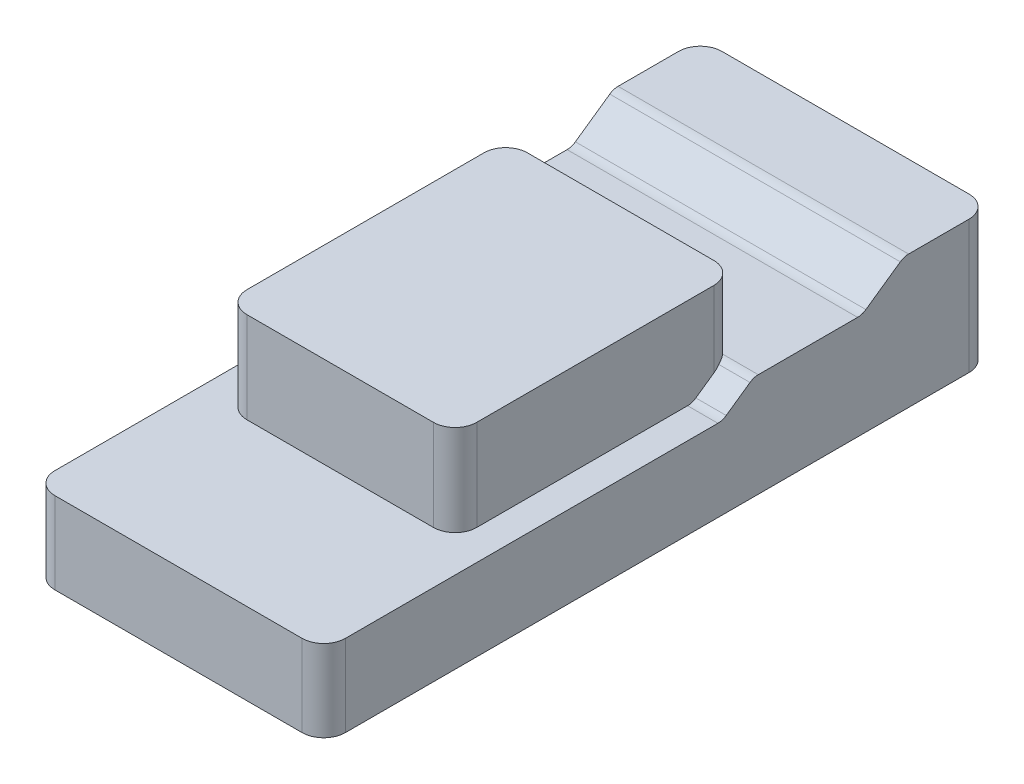
ISO-10303-21;
HEADER;
FILE_DESCRIPTION(('STEP AP214'),'2;1');
FILE_NAME('part.step','',(''),(''),'','','');
FILE_SCHEMA(('AUTOMOTIVE_DESIGN { 1 0 10303 214 1 1 1 1 }'));
ENDSEC;
DATA;
#1=APPLICATION_CONTEXT('core data for automotive mechanical design processes');
#2=APPLICATION_PROTOCOL_DEFINITION('international standard','automotive_design',2000,#1);
#3=PRODUCT_CONTEXT('',#1,'mechanical');
#4=PRODUCT('Part','Part','',(#3));
#5=PRODUCT_RELATED_PRODUCT_CATEGORY('part','',(#4));
#6=PRODUCT_DEFINITION_FORMATION('','',#4);
#7=PRODUCT_DEFINITION_CONTEXT('part definition',#1,'design');
#8=PRODUCT_DEFINITION('design','',#6,#7);
#9=PRODUCT_DEFINITION_SHAPE('','',#8);
#10=(LENGTH_UNIT() NAMED_UNIT(*) SI_UNIT(.MILLI.,.METRE.));
#11=(NAMED_UNIT(*) PLANE_ANGLE_UNIT() SI_UNIT($,.RADIAN.));
#12=(NAMED_UNIT(*) SI_UNIT($,.STERADIAN.) SOLID_ANGLE_UNIT());
#13=UNCERTAINTY_MEASURE_WITH_UNIT(LENGTH_MEASURE(1.E-05),#10,'distance_accuracy_value','');
#14=(GEOMETRIC_REPRESENTATION_CONTEXT(3) GLOBAL_UNCERTAINTY_ASSIGNED_CONTEXT((#13)) GLOBAL_UNIT_ASSIGNED_CONTEXT((#10,
#11,#12)) REPRESENTATION_CONTEXT('',''));
#15=CARTESIAN_POINT('',(0.,0.,0.));
#16=DIRECTION('',(0.,0.,1.));
#17=DIRECTION('',(1.,0.,0.));
#18=AXIS2_PLACEMENT_3D('',#15,#16,#17);
#19=CARTESIAN_POINT('',(-40.2,11.3,-9.02443063219845));
#20=DIRECTION('',(0.,1.,0.));
#21=DIRECTION('',(0.,0.,1.));
#22=AXIS2_PLACEMENT_3D('',#19,#20,#21);
#23=PLANE('',#22);
#24=DIRECTION('',(0.,0.,1.));
#25=VECTOR('',#24,1.);
#26=CARTESIAN_POINT('',(-36.,11.3,-15.0244306321985));
#27=LINE('',#26,#25);
#28=CARTESIAN_POINT('',(-36.,11.3,-8.39383305444048));
#29=VERTEX_POINT('',#28);
#30=CARTESIAN_POINT('',(-36.,11.3,20.7755693678015));
#31=VERTEX_POINT('',#30);
#32=EDGE_CURVE('E527',#29,#31,#27,.T.);
#33=ORIENTED_EDGE('',*,*,#32,.F.);
#34=DIRECTION('',(1.,0.,0.));
#35=VECTOR('',#34,1.);
#36=CARTESIAN_POINT('',(-40.2,11.3,-8.39383305444048));
#37=LINE('',#36,#35);
#38=CARTESIAN_POINT('',(-40.2,11.3,-8.39383305444048));
#39=VERTEX_POINT('',#38);
#40=EDGE_CURVE('E338',#29,#39,#37,.F.);
#41=ORIENTED_EDGE('',*,*,#40,.T.);
#42=DIRECTION('',(0.,0.,1.));
#43=VECTOR('',#42,1.);
#44=CARTESIAN_POINT('',(-40.2,11.3,-9.02443063219845));
#45=LINE('',#44,#43);
#46=CARTESIAN_POINT('',(-40.2,11.3,43.15));
#47=VERTEX_POINT('',#46);
#48=EDGE_CURVE('E503',#39,#47,#45,.T.);
#49=ORIENTED_EDGE('',*,*,#48,.T.);
#50=CARTESIAN_POINT('',(-37.2,11.3,43.15));
#51=DIRECTION('',(0.,1.,0.));
#52=DIRECTION('',(0.,0.,1.));
#53=AXIS2_PLACEMENT_3D('',#50,#51,#52);
#54=CIRCLE('',#53,3.);
#55=CARTESIAN_POINT('',(-37.2,11.3,46.15));
#56=VERTEX_POINT('',#55);
#57=EDGE_CURVE('E329',#47,#56,#54,.T.);
#58=ORIENTED_EDGE('',*,*,#57,.T.);
#59=DIRECTION('',(1.,0.,0.));
#60=VECTOR('',#59,1.);
#61=CARTESIAN_POINT('',(-40.2,11.3,46.15));
#62=LINE('',#61,#60);
#63=CARTESIAN_POINT('',(-3.,11.3,46.15));
#64=VERTEX_POINT('',#63);
#65=EDGE_CURVE('E494',#56,#64,#62,.T.);
#66=ORIENTED_EDGE('',*,*,#65,.T.);
#67=CARTESIAN_POINT('',(-3.,11.3,43.15));
#68=DIRECTION('',(0.,1.,0.));
#69=DIRECTION('',(0.,0.,1.));
#70=AXIS2_PLACEMENT_3D('',#67,#68,#69);
#71=CIRCLE('',#70,3.);
#72=CARTESIAN_POINT('',(0.,11.3,43.15));
#73=VERTEX_POINT('',#72);
#74=EDGE_CURVE('E326',#64,#73,#71,.T.);
#75=ORIENTED_EDGE('',*,*,#74,.T.);
#76=DIRECTION('',(0.,0.,1.));
#77=VECTOR('',#76,1.);
#78=CARTESIAN_POINT('',(0.,11.3,-9.02443063219845));
#79=LINE('',#78,#77);
#80=CARTESIAN_POINT('',(0.,11.3,-8.39383305444048));
#81=VERTEX_POINT('',#80);
#82=EDGE_CURVE('E482',#81,#73,#79,.T.);
#83=ORIENTED_EDGE('',*,*,#82,.F.);
#84=DIRECTION('',(1.,0.,0.));
#85=VECTOR('',#84,1.);
#86=CARTESIAN_POINT('',(-4.2,11.3,-8.39383305444048));
#87=LINE('',#86,#85);
#88=CARTESIAN_POINT('',(-4.19999999999999,11.3,-8.39383305444048));
#89=VERTEX_POINT('',#88);
#90=EDGE_CURVE('E336',#81,#89,#87,.F.);
#91=ORIENTED_EDGE('',*,*,#90,.T.);
#92=DIRECTION('',(0.,0.,-1.));
#93=VECTOR('',#92,1.);
#94=CARTESIAN_POINT('',(-4.19999999999997,11.3,23.7755693678015));
#95=LINE('',#94,#93);
#96=CARTESIAN_POINT('',(-4.19999999999998,11.3,20.7755693678015));
#97=VERTEX_POINT('',#96);
#98=EDGE_CURVE('E532',#97,#89,#95,.T.);
#99=ORIENTED_EDGE('',*,*,#98,.F.);
#100=CARTESIAN_POINT('',(-7.19999999999998,11.3,20.7755693678015));
#101=DIRECTION('',(0.,1.,0.));
#102=DIRECTION('',(0.,0.,1.));
#103=AXIS2_PLACEMENT_3D('',#100,#101,#102);
#104=CIRCLE('',#103,3.);
#105=CARTESIAN_POINT('',(-7.19999999999998,11.3,23.7755693678015));
#106=VERTEX_POINT('',#105);
#107=EDGE_CURVE('E291',#97,#106,#104,.F.);
#108=ORIENTED_EDGE('',*,*,#107,.T.);
#109=DIRECTION('',(1.,0.,0.));
#110=VECTOR('',#109,1.);
#111=CARTESIAN_POINT('',(-36.,11.3,23.7755693678015));
#112=LINE('',#111,#110);
#113=CARTESIAN_POINT('',(-33.,11.3,23.7755693678015));
#114=VERTEX_POINT('',#113);
#115=EDGE_CURVE('E529',#114,#106,#112,.T.);
#116=ORIENTED_EDGE('',*,*,#115,.F.);
#117=CARTESIAN_POINT('',(-33.,11.3,20.7755693678015));
#118=DIRECTION('',(0.,1.,0.));
#119=DIRECTION('',(0.,0.,1.));
#120=AXIS2_PLACEMENT_3D('',#117,#118,#119);
#121=CIRCLE('',#120,3.);
#122=EDGE_CURVE('E288',#114,#31,#121,.F.);
#123=ORIENTED_EDGE('',*,*,#122,.T.);
#124=EDGE_LOOP('',(#33,#41,#49,#58,#66,#75,#83,#91,#99,#108,#116,#123));
#125=FACE_BOUND('',#124,.T.);
#126=ADVANCED_FACE('F41',(#125),#23,.T.);
#127=CARTESIAN_POINT('',(-40.2,14.33,-13.3517190926271));
#128=DIRECTION('',(0.,0.819152044288991,0.573576436351047));
#129=DIRECTION('',(0.,-0.573576436351047,0.819152044288991));
#130=AXIS2_PLACEMENT_3D('',#127,#128,#129);
#131=PLANE('',#130);
#132=DIRECTION('',(0.,-0.573576436351047,0.819152044288991));
#133=VECTOR('',#132,1.);
#134=CARTESIAN_POINT('',(-40.2,14.33,-13.3517190926271));
#135=LINE('',#134,#133);
#136=CARTESIAN_POINT('',(-40.2,13.968304088578,-12.8351637976829));
#137=VERTEX_POINT('',#136);
#138=CARTESIAN_POINT('',(-40.2,11.661695911422,-9.54098592714258));
#139=VERTEX_POINT('',#138);
#140=EDGE_CURVE('E541',#137,#139,#135,.T.);
#141=ORIENTED_EDGE('',*,*,#140,.T.);
#142=DIRECTION('',(1.,0.,0.));
#143=VECTOR('',#142,1.);
#144=CARTESIAN_POINT('',(-36.,11.661695911422,-9.54098592714258));
#145=LINE('',#144,#143);
#146=CARTESIAN_POINT('',(-36.,11.661695911422,-9.54098592714258));
#147=VERTEX_POINT('',#146);
#148=EDGE_CURVE('E234',#139,#147,#145,.T.);
#149=ORIENTED_EDGE('',*,*,#148,.T.);
#150=DIRECTION('',(0.,0.573576436351047,-0.819152044288991));
#151=VECTOR('',#150,1.);
#152=CARTESIAN_POINT('',(-36.,14.33,-13.3517190926271));
#153=LINE('',#152,#151);
#154=CARTESIAN_POINT('',(-36.,13.4006226146291,-12.0244306321985));
#155=VERTEX_POINT('',#154);
#156=EDGE_CURVE('E227',#147,#155,#153,.T.);
#157=ORIENTED_EDGE('',*,*,#156,.T.);
#158=CARTESIAN_POINT('',(-33.,13.4006226146291,-12.0244306321985));
#159=DIRECTION('',(0.,0.819152044288991,0.573576436351047));
#160=DIRECTION('',(0.,-0.573576436351047,0.819152044288991));
#161=AXIS2_PLACEMENT_3D('',#158,#159,#160);
#162=ELLIPSE('',#161,3.66232376628437,3.);
#163=CARTESIAN_POINT('',(-35.8883752758919,13.968304088578,-12.8351637976829));
#164=VERTEX_POINT('',#163);
#165=EDGE_CURVE('E231',#155,#164,#162,.F.);
#166=ORIENTED_EDGE('',*,*,#165,.T.);
#167=DIRECTION('',(1.,0.,0.));
#168=VECTOR('',#167,1.);
#169=CARTESIAN_POINT('',(-40.2,13.968304088578,-12.8351637976829));
#170=LINE('',#169,#168);
#171=EDGE_CURVE('E331',#164,#137,#170,.F.);
#172=ORIENTED_EDGE('',*,*,#171,.T.);
#173=EDGE_LOOP('',(#141,#149,#157,#166,#172));
#174=FACE_BOUND('',#173,.T.);
#175=ADVANCED_FACE('F230',(#174),#131,.T.);
#176=DIRECTION('',(0.,-0.573576436351047,0.819152044288991));
#177=VECTOR('',#176,1.);
#178=CARTESIAN_POINT('',(-4.2,14.33,-13.3517190926271));
#179=LINE('',#178,#177);
#180=CARTESIAN_POINT('',(-4.19999999999999,13.4006226146291,-12.0244306321985));
#181=VERTEX_POINT('',#180);
#182=CARTESIAN_POINT('',(-4.19999999999999,11.661695911422,-9.54098592714258));
#183=VERTEX_POINT('',#182);
#184=EDGE_CURVE('E238',#181,#183,#179,.T.);
#185=ORIENTED_EDGE('',*,*,#184,.T.);
#186=DIRECTION('',(1.,0.,0.));
#187=VECTOR('',#186,1.);
#188=CARTESIAN_POINT('',(0.,11.661695911422,-9.54098592714258));
#189=LINE('',#188,#187);
#190=CARTESIAN_POINT('',(0.,11.661695911422,-9.54098592714258));
#191=VERTEX_POINT('',#190);
#192=EDGE_CURVE('E342',#183,#191,#189,.T.);
#193=ORIENTED_EDGE('',*,*,#192,.T.);
#194=DIRECTION('',(0.,-0.573576436351047,0.819152044288991));
#195=VECTOR('',#194,1.);
#196=CARTESIAN_POINT('',(0.,14.33,-13.3517190926271));
#197=LINE('',#196,#195);
#198=CARTESIAN_POINT('',(0.,13.968304088578,-12.8351637976829));
#199=VERTEX_POINT('',#198);
#200=EDGE_CURVE('E553',#199,#191,#197,.T.);
#201=ORIENTED_EDGE('',*,*,#200,.F.);
#202=DIRECTION('',(1.,0.,0.));
#203=VECTOR('',#202,1.);
#204=CARTESIAN_POINT('',(-40.2,13.968304088578,-12.8351637976829));
#205=LINE('',#204,#203);
#206=CARTESIAN_POINT('',(-4.31162472410811,13.968304088578,-12.8351637976829));
#207=VERTEX_POINT('',#206);
#208=EDGE_CURVE('E340',#199,#207,#205,.F.);
#209=ORIENTED_EDGE('',*,*,#208,.T.);
#210=CARTESIAN_POINT('',(-7.19999999999999,13.4006226146291,-12.0244306321985));
#211=DIRECTION('',(0.,0.819152044288991,0.573576436351047));
#212=DIRECTION('',(0.,-0.573576436351047,0.819152044288991));
#213=AXIS2_PLACEMENT_3D('',#210,#211,#212);
#214=ELLIPSE('',#213,3.66232376628437,3.);
#215=EDGE_CURVE('E286',#207,#181,#214,.F.);
#216=ORIENTED_EDGE('',*,*,#215,.T.);
#217=EDGE_LOOP('',(#185,#193,#201,#209,#216));
#218=FACE_BOUND('',#217,.T.);
#219=ADVANCED_FACE('F443',(#218),#131,.T.);
#220=CARTESIAN_POINT('',(-40.2,14.33,-28.3517190926271));
#221=DIRECTION('',(0.,1.,0.));
#222=DIRECTION('',(0.,0.,1.));
#223=AXIS2_PLACEMENT_3D('',#220,#221,#222);
#224=PLANE('',#223);
#225=DIRECTION('',(0.,0.,1.));
#226=VECTOR('',#225,1.);
#227=CARTESIAN_POINT('',(-40.2,14.33,-28.3517190926271));
#228=LINE('',#227,#226);
#229=CARTESIAN_POINT('',(-40.2,14.33,-27.7211215148691));
#230=VERTEX_POINT('',#229);
#231=CARTESIAN_POINT('',(-40.2,14.33,-13.982316670385));
#232=VERTEX_POINT('',#231);
#233=EDGE_CURVE('E539',#230,#232,#228,.T.);
#234=ORIENTED_EDGE('',*,*,#233,.T.);
#235=DIRECTION('',(1.,0.,0.));
#236=VECTOR('',#235,1.);
#237=CARTESIAN_POINT('',(-40.2,14.33,-13.982316670385));
#238=LINE('',#237,#236);
#239=CARTESIAN_POINT('',(-35.2730337132287,14.33,-13.982316670385));
#240=VERTEX_POINT('',#239);
#241=EDGE_CURVE('E352',#232,#240,#238,.T.);
#242=ORIENTED_EDGE('',*,*,#241,.T.);
#243=CARTESIAN_POINT('',(-33.,14.33,-12.0244306321985));
#244=DIRECTION('',(0.,1.,0.));
#245=DIRECTION('',(0.,0.,1.));
#246=AXIS2_PLACEMENT_3D('',#243,#244,#245);
#247=CIRCLE('',#246,3.);
#248=CARTESIAN_POINT('',(-33.,14.33,-15.0244306321985));
#249=VERTEX_POINT('',#248);
#250=EDGE_CURVE('E247',#240,#249,#247,.F.);
#251=ORIENTED_EDGE('',*,*,#250,.T.);
#252=DIRECTION('',(1.,0.,0.));
#253=VECTOR('',#252,1.);
#254=CARTESIAN_POINT('',(-40.2,14.33,-15.0244306321985));
#255=LINE('',#254,#253);
#256=CARTESIAN_POINT('',(-7.19999999999999,14.33,-15.0244306321985));
#257=VERTEX_POINT('',#256);
#258=EDGE_CURVE('E260',#249,#257,#255,.T.);
#259=ORIENTED_EDGE('',*,*,#258,.T.);
#260=CARTESIAN_POINT('',(-7.19999999999999,14.33,-12.0244306321985));
#261=DIRECTION('',(0.,1.,0.));
#262=DIRECTION('',(0.,0.,1.));
#263=AXIS2_PLACEMENT_3D('',#260,#261,#262);
#264=CIRCLE('',#263,3.);
#265=CARTESIAN_POINT('',(-4.92696628677132,14.33,-13.982316670385));
#266=VERTEX_POINT('',#265);
#267=EDGE_CURVE('E283',#257,#266,#264,.F.);
#268=ORIENTED_EDGE('',*,*,#267,.T.);
#269=DIRECTION('',(1.,0.,0.));
#270=VECTOR('',#269,1.);
#271=CARTESIAN_POINT('',(-40.2,14.33,-13.982316670385));
#272=LINE('',#271,#270);
#273=CARTESIAN_POINT('',(0.,14.33,-13.982316670385));
#274=VERTEX_POINT('',#273);
#275=EDGE_CURVE('E349',#266,#274,#272,.T.);
#276=ORIENTED_EDGE('',*,*,#275,.T.);
#277=DIRECTION('',(0.,0.,1.));
#278=VECTOR('',#277,1.);
#279=CARTESIAN_POINT('',(0.,14.33,-28.3517190926271));
#280=LINE('',#279,#278);
#281=CARTESIAN_POINT('',(0.,14.33,-27.7211215148691));
#282=VERTEX_POINT('',#281);
#283=EDGE_CURVE('E550',#282,#274,#280,.T.);
#284=ORIENTED_EDGE('',*,*,#283,.F.);
#285=DIRECTION('',(1.,0.,0.));
#286=VECTOR('',#285,1.);
#287=CARTESIAN_POINT('',(-40.2,14.33,-27.7211215148691));
#288=LINE('',#287,#286);
#289=EDGE_CURVE('E347',#282,#230,#288,.F.);
#290=ORIENTED_EDGE('',*,*,#289,.T.);
#291=EDGE_LOOP('',(#234,#242,#251,#259,#268,#276,#284,#290));
#292=FACE_BOUND('',#291,.T.);
#293=ADVANCED_FACE('F450',(#292),#224,.T.);
#294=CARTESIAN_POINT('',(-40.2,0.,46.15));
#295=DIRECTION('',(0.,0.,1.));
#296=DIRECTION('',(1.,0.,0.));
#297=AXIS2_PLACEMENT_3D('',#294,#295,#296);
#298=PLANE('',#297);
#299=ORIENTED_EDGE('',*,*,#65,.F.);
#300=DIRECTION('',(0.,-1.,0.));
#301=VECTOR('',#300,1.);
#302=CARTESIAN_POINT('',(-37.2,0.,46.15));
#303=LINE('',#302,#301);
#304=CARTESIAN_POINT('',(-37.2,0.,46.15));
#305=VERTEX_POINT('',#304);
#306=EDGE_CURVE('E323',#56,#305,#303,.T.);
#307=ORIENTED_EDGE('',*,*,#306,.T.);
#308=DIRECTION('',(1.,0.,0.));
#309=VECTOR('',#308,1.);
#310=CARTESIAN_POINT('',(-40.2,0.,46.15));
#311=LINE('',#310,#309);
#312=CARTESIAN_POINT('',(-3.,0.,46.15));
#313=VERTEX_POINT('',#312);
#314=EDGE_CURVE('E498',#305,#313,#311,.T.);
#315=ORIENTED_EDGE('',*,*,#314,.T.);
#316=DIRECTION('',(0.,-1.,0.));
#317=VECTOR('',#316,1.);
#318=CARTESIAN_POINT('',(-3.,0.,46.15));
#319=LINE('',#318,#317);
#320=EDGE_CURVE('E321',#313,#64,#319,.F.);
#321=ORIENTED_EDGE('',*,*,#320,.T.);
#322=EDGE_LOOP('',(#299,#307,#315,#321));
#323=FACE_BOUND('',#322,.T.);
#324=ADVANCED_FACE('F395',(#323),#298,.T.);
#325=CARTESIAN_POINT('',(-40.2,18.39,-34.15));
#326=DIRECTION('',(0.,0.819152044288991,0.573576436351047));
#327=DIRECTION('',(0.,-0.573576436351047,0.819152044288991));
#328=AXIS2_PLACEMENT_3D('',#325,#326,#327);
#329=PLANE('',#328);
#330=DIRECTION('',(0.,-0.573576436351047,0.819152044288991));
#331=VECTOR('',#330,1.);
#332=CARTESIAN_POINT('',(-40.2,18.39,-34.15));
#333=LINE('',#332,#331);
#334=CARTESIAN_POINT('',(-40.2,18.028304088578,-33.6334447050559));
#335=VERTEX_POINT('',#334);
#336=CARTESIAN_POINT('',(-40.2,14.691695911422,-28.8682743875712));
#337=VERTEX_POINT('',#336);
#338=EDGE_CURVE('E536',#335,#337,#333,.T.);
#339=ORIENTED_EDGE('',*,*,#338,.T.);
#340=DIRECTION('',(1.,0.,0.));
#341=VECTOR('',#340,1.);
#342=CARTESIAN_POINT('',(0.,14.691695911422,-28.8682743875712));
#343=LINE('',#342,#341);
#344=CARTESIAN_POINT('',(0.,14.691695911422,-28.8682743875712));
#345=VERTEX_POINT('',#344);
#346=EDGE_CURVE('E364',#337,#345,#343,.T.);
#347=ORIENTED_EDGE('',*,*,#346,.T.);
#348=DIRECTION('',(0.,-0.573576436351047,0.819152044288991));
#349=VECTOR('',#348,1.);
#350=CARTESIAN_POINT('',(0.,18.39,-34.15));
#351=LINE('',#350,#349);
#352=CARTESIAN_POINT('',(0.,18.028304088578,-33.6334447050559));
#353=VERTEX_POINT('',#352);
#354=EDGE_CURVE('E548',#353,#345,#351,.T.);
#355=ORIENTED_EDGE('',*,*,#354,.F.);
#356=DIRECTION('',(1.,0.,0.));
#357=VECTOR('',#356,1.);
#358=CARTESIAN_POINT('',(-40.2,18.028304088578,-33.6334447050559));
#359=LINE('',#358,#357);
#360=EDGE_CURVE('E362',#353,#335,#359,.F.);
#361=ORIENTED_EDGE('',*,*,#360,.T.);
#362=EDGE_LOOP('',(#339,#347,#355,#361));
#363=FACE_BOUND('',#362,.T.);
#364=ADVANCED_FACE('F454',(#363),#329,.T.);
#365=CARTESIAN_POINT('',(-40.2,18.39,-46.15));
#366=DIRECTION('',(0.,1.,0.));
#367=DIRECTION('',(0.,0.,1.));
#368=AXIS2_PLACEMENT_3D('',#365,#366,#367);
#369=PLANE('',#368);
#370=DIRECTION('',(0.,0.,1.));
#371=VECTOR('',#370,1.);
#372=CARTESIAN_POINT('',(-40.2,18.39,-46.15));
#373=LINE('',#372,#371);
#374=CARTESIAN_POINT('',(-40.2,18.39,-43.15));
#375=VERTEX_POINT('',#374);
#376=CARTESIAN_POINT('',(-40.2,18.39,-34.780597577758));
#377=VERTEX_POINT('',#376);
#378=EDGE_CURVE('E481',#375,#377,#373,.T.);
#379=ORIENTED_EDGE('',*,*,#378,.T.);
#380=DIRECTION('',(1.,0.,0.));
#381=VECTOR('',#380,1.);
#382=CARTESIAN_POINT('',(-40.2,18.39,-34.780597577758));
#383=LINE('',#382,#381);
#384=CARTESIAN_POINT('',(0.,18.39,-34.780597577758));
#385=VERTEX_POINT('',#384);
#386=EDGE_CURVE('E366',#377,#385,#383,.T.);
#387=ORIENTED_EDGE('',*,*,#386,.T.);
#388=DIRECTION('',(0.,0.,1.));
#389=VECTOR('',#388,1.);
#390=CARTESIAN_POINT('',(0.,18.39,-46.15));
#391=LINE('',#390,#389);
#392=CARTESIAN_POINT('',(0.,18.39,-43.15));
#393=VERTEX_POINT('',#392);
#394=EDGE_CURVE('E546',#393,#385,#391,.T.);
#395=ORIENTED_EDGE('',*,*,#394,.F.);
#396=CARTESIAN_POINT('',(-3.,18.39,-43.15));
#397=DIRECTION('',(0.,1.,0.));
#398=DIRECTION('',(0.,0.,1.));
#399=AXIS2_PLACEMENT_3D('',#396,#397,#398);
#400=CIRCLE('',#399,3.);
#401=CARTESIAN_POINT('',(-3.,18.39,-46.15));
#402=VERTEX_POINT('',#401);
#403=EDGE_CURVE('E298',#393,#402,#400,.T.);
#404=ORIENTED_EDGE('',*,*,#403,.T.);
#405=DIRECTION('',(1.,0.,0.));
#406=VECTOR('',#405,1.);
#407=CARTESIAN_POINT('',(-40.2,18.39,-46.15));
#408=LINE('',#407,#406);
#409=CARTESIAN_POINT('',(-37.2,18.39,-46.15));
#410=VERTEX_POINT('',#409);
#411=EDGE_CURVE('E488',#410,#402,#408,.T.);
#412=ORIENTED_EDGE('',*,*,#411,.F.);
#413=CARTESIAN_POINT('',(-37.2,18.39,-43.15));
#414=DIRECTION('',(0.,1.,0.));
#415=DIRECTION('',(0.,0.,1.));
#416=AXIS2_PLACEMENT_3D('',#413,#414,#415);
#417=CIRCLE('',#416,3.);
#418=EDGE_CURVE('E300',#410,#375,#417,.T.);
#419=ORIENTED_EDGE('',*,*,#418,.T.);
#420=EDGE_LOOP('',(#379,#387,#395,#404,#412,#419));
#421=FACE_BOUND('',#420,.T.);
#422=ADVANCED_FACE('F457',(#421),#369,.T.);
#423=CARTESIAN_POINT('',(-40.2,0.,-46.15));
#424=DIRECTION('',(0.,0.,-1.));
#425=DIRECTION('',(-1.,0.,0.));
#426=AXIS2_PLACEMENT_3D('',#423,#424,#425);
#427=PLANE('',#426);
#428=DIRECTION('',(1.,0.,0.));
#429=VECTOR('',#428,1.);
#430=CARTESIAN_POINT('',(-40.2,0.,-46.15));
#431=LINE('',#430,#429);
#432=CARTESIAN_POINT('',(-37.2,0.,-46.15));
#433=VERTEX_POINT('',#432);
#434=CARTESIAN_POINT('',(-3.,0.,-46.15));
#435=VERTEX_POINT('',#434);
#436=EDGE_CURVE('E490',#433,#435,#431,.T.);
#437=ORIENTED_EDGE('',*,*,#436,.F.);
#438=DIRECTION('',(0.,1.,0.));
#439=VECTOR('',#438,1.);
#440=CARTESIAN_POINT('',(-37.2,18.39,-46.15));
#441=LINE('',#440,#439);
#442=EDGE_CURVE('E295',#433,#410,#441,.T.);
#443=ORIENTED_EDGE('',*,*,#442,.T.);
#444=ORIENTED_EDGE('',*,*,#411,.T.);
#445=DIRECTION('',(0.,1.,0.));
#446=VECTOR('',#445,1.);
#447=CARTESIAN_POINT('',(-3.,0.,-46.15));
#448=LINE('',#447,#446);
#449=EDGE_CURVE('E293',#402,#435,#448,.F.);
#450=ORIENTED_EDGE('',*,*,#449,.T.);
#451=EDGE_LOOP('',(#437,#443,#444,#450));
#452=FACE_BOUND('',#451,.T.);
#453=ADVANCED_FACE('F461',(#452),#427,.T.);
#454=CARTESIAN_POINT('',(-40.2,0.,-46.15));
#455=DIRECTION('',(0.,-1.,0.));
#456=DIRECTION('',(0.,0.,-1.));
#457=AXIS2_PLACEMENT_3D('',#454,#455,#456);
#458=PLANE('',#457);
#459=DIRECTION('',(0.,0.,-1.));
#460=VECTOR('',#459,1.);
#461=CARTESIAN_POINT('',(-40.2,0.,-46.15));
#462=LINE('',#461,#460);
#463=CARTESIAN_POINT('',(-40.2,0.,43.15));
#464=VERTEX_POINT('',#463);
#465=CARTESIAN_POINT('',(-40.2,0.,-43.15));
#466=VERTEX_POINT('',#465);
#467=EDGE_CURVE('E475',#464,#466,#462,.T.);
#468=ORIENTED_EDGE('',*,*,#467,.T.);
#469=CARTESIAN_POINT('',(-37.2,0.,-43.15));
#470=DIRECTION('',(0.,-1.,0.));
#471=DIRECTION('',(0.,0.,-1.));
#472=AXIS2_PLACEMENT_3D('',#469,#470,#471);
#473=CIRCLE('',#472,3.);
#474=EDGE_CURVE('E313',#466,#433,#473,.T.);
#475=ORIENTED_EDGE('',*,*,#474,.T.);
#476=ORIENTED_EDGE('',*,*,#436,.T.);
#477=CARTESIAN_POINT('',(-3.,0.,-43.15));
#478=DIRECTION('',(0.,-1.,0.));
#479=DIRECTION('',(0.,0.,-1.));
#480=AXIS2_PLACEMENT_3D('',#477,#478,#479);
#481=CIRCLE('',#480,3.);
#482=CARTESIAN_POINT('',(0.,0.,-43.15));
#483=VERTEX_POINT('',#482);
#484=EDGE_CURVE('E311',#435,#483,#481,.T.);
#485=ORIENTED_EDGE('',*,*,#484,.T.);
#486=DIRECTION('',(0.,0.,-1.));
#487=VECTOR('',#486,1.);
#488=CARTESIAN_POINT('',(0.,0.,-46.15));
#489=LINE('',#488,#487);
#490=CARTESIAN_POINT('',(0.,0.,43.15));
#491=VERTEX_POINT('',#490);
#492=EDGE_CURVE('E237',#491,#483,#489,.T.);
#493=ORIENTED_EDGE('',*,*,#492,.F.);
#494=CARTESIAN_POINT('',(-3.,0.,43.15));
#495=DIRECTION('',(0.,-1.,0.));
#496=DIRECTION('',(0.,0.,-1.));
#497=AXIS2_PLACEMENT_3D('',#494,#495,#496);
#498=CIRCLE('',#497,3.);
#499=EDGE_CURVE('E307',#491,#313,#498,.T.);
#500=ORIENTED_EDGE('',*,*,#499,.T.);
#501=ORIENTED_EDGE('',*,*,#314,.F.);
#502=CARTESIAN_POINT('',(-37.2,0.,43.15));
#503=DIRECTION('',(0.,-1.,0.));
#504=DIRECTION('',(0.,0.,-1.));
#505=AXIS2_PLACEMENT_3D('',#502,#503,#504);
#506=CIRCLE('',#505,3.);
#507=EDGE_CURVE('E309',#305,#464,#506,.T.);
#508=ORIENTED_EDGE('',*,*,#507,.T.);
#509=EDGE_LOOP('',(#468,#475,#476,#485,#493,#500,#501,#508));
#510=FACE_BOUND('',#509,.T.);
#511=ADVANCED_FACE('F464',(#510),#458,.T.);
#512=CARTESIAN_POINT('',(-40.2,0.,0.));
#513=DIRECTION('',(1.,0.,0.));
#514=DIRECTION('',(0.,0.,-1.));
#515=AXIS2_PLACEMENT_3D('',#512,#513,#514);
#516=PLANE('',#515);
#517=ORIENTED_EDGE('',*,*,#140,.F.);
#518=CARTESIAN_POINT('',(-40.2,12.33,-13.982316670385));
#519=DIRECTION('',(1.,0.,0.));
#520=DIRECTION('',(0.,0.,-1.));
#521=AXIS2_PLACEMENT_3D('',#518,#519,#520);
#522=CIRCLE('',#521,2.);
#523=EDGE_CURVE('E357',#137,#232,#522,.F.);
#524=ORIENTED_EDGE('',*,*,#523,.T.);
#525=ORIENTED_EDGE('',*,*,#233,.F.);
#526=CARTESIAN_POINT('',(-40.2,16.33,-27.7211215148691));
#527=DIRECTION('',(1.,0.,0.));
#528=DIRECTION('',(0.,0.,-1.));
#529=AXIS2_PLACEMENT_3D('',#526,#527,#528);
#530=CIRCLE('',#529,2.);
#531=EDGE_CURVE('E11',#230,#337,#530,.T.);
#532=ORIENTED_EDGE('',*,*,#531,.T.);
#533=ORIENTED_EDGE('',*,*,#338,.F.);
#534=CARTESIAN_POINT('',(-40.2,16.39,-34.780597577758));
#535=DIRECTION('',(1.,0.,0.));
#536=DIRECTION('',(0.,0.,-1.));
#537=AXIS2_PLACEMENT_3D('',#534,#535,#536);
#538=CIRCLE('',#537,2.);
#539=EDGE_CURVE('E355',#335,#377,#538,.F.);
#540=ORIENTED_EDGE('',*,*,#539,.T.);
#541=ORIENTED_EDGE('',*,*,#378,.F.);
#542=DIRECTION('',(0.,1.,0.));
#543=VECTOR('',#542,1.);
#544=CARTESIAN_POINT('',(-40.2,0.,-43.15));
#545=LINE('',#544,#543);
#546=EDGE_CURVE('E305',#375,#466,#545,.F.);
#547=ORIENTED_EDGE('',*,*,#546,.T.);
#548=ORIENTED_EDGE('',*,*,#467,.F.);
#549=DIRECTION('',(0.,-1.,0.));
#550=VECTOR('',#549,1.);
#551=CARTESIAN_POINT('',(-40.2,11.3,43.15));
#552=LINE('',#551,#550);
#553=EDGE_CURVE('E302',#464,#47,#552,.F.);
#554=ORIENTED_EDGE('',*,*,#553,.T.);
#555=ORIENTED_EDGE('',*,*,#48,.F.);
#556=CARTESIAN_POINT('',(-40.2,13.3,-8.39383305444048));
#557=DIRECTION('',(1.,0.,0.));
#558=DIRECTION('',(0.,0.,-1.));
#559=AXIS2_PLACEMENT_3D('',#556,#557,#558);
#560=CIRCLE('',#559,2.);
#561=EDGE_CURVE('E369',#39,#139,#560,.T.);
#562=ORIENTED_EDGE('',*,*,#561,.T.);
#563=EDGE_LOOP('',(#517,#524,#525,#532,#533,#540,#541,#547,#548,#554,#555,#562));
#564=FACE_BOUND('',#563,.T.);
#565=ADVANCED_FACE('F467',(#564),#516,.F.);
#566=CARTESIAN_POINT('',(0.,0.,0.));
#567=DIRECTION('',(1.,0.,0.));
#568=DIRECTION('',(0.,0.,-1.));
#569=AXIS2_PLACEMENT_3D('',#566,#567,#568);
#570=PLANE('',#569);
#571=ORIENTED_EDGE('',*,*,#283,.T.);
#572=CARTESIAN_POINT('',(0.,12.33,-13.982316670385));
#573=DIRECTION('',(1.,0.,0.));
#574=DIRECTION('',(0.,0.,-1.));
#575=AXIS2_PLACEMENT_3D('',#572,#573,#574);
#576=CIRCLE('',#575,2.);
#577=EDGE_CURVE('E360',#274,#199,#576,.T.);
#578=ORIENTED_EDGE('',*,*,#577,.T.);
#579=ORIENTED_EDGE('',*,*,#200,.T.);
#580=CARTESIAN_POINT('',(0.,13.3,-8.39383305444048));
#581=DIRECTION('',(1.,0.,0.));
#582=DIRECTION('',(0.,0.,-1.));
#583=AXIS2_PLACEMENT_3D('',#580,#581,#582);
#584=CIRCLE('',#583,2.);
#585=EDGE_CURVE('E371',#191,#81,#584,.F.);
#586=ORIENTED_EDGE('',*,*,#585,.T.);
#587=ORIENTED_EDGE('',*,*,#82,.T.);
#588=DIRECTION('',(0.,-1.,0.));
#589=VECTOR('',#588,1.);
#590=CARTESIAN_POINT('',(0.,0.,43.15));
#591=LINE('',#590,#589);
#592=EDGE_CURVE('E315',#73,#491,#591,.T.);
#593=ORIENTED_EDGE('',*,*,#592,.T.);
#594=ORIENTED_EDGE('',*,*,#492,.T.);
#595=DIRECTION('',(0.,1.,0.));
#596=VECTOR('',#595,1.);
#597=CARTESIAN_POINT('',(0.,0.,-43.15));
#598=LINE('',#597,#596);
#599=EDGE_CURVE('E318',#483,#393,#598,.T.);
#600=ORIENTED_EDGE('',*,*,#599,.T.);
#601=ORIENTED_EDGE('',*,*,#394,.T.);
#602=CARTESIAN_POINT('',(0.,16.39,-34.780597577758));
#603=DIRECTION('',(1.,0.,0.));
#604=DIRECTION('',(0.,0.,-1.));
#605=AXIS2_PLACEMENT_3D('',#602,#603,#604);
#606=CIRCLE('',#605,2.);
#607=EDGE_CURVE('E63',#385,#353,#606,.T.);
#608=ORIENTED_EDGE('',*,*,#607,.T.);
#609=ORIENTED_EDGE('',*,*,#354,.T.);
#610=CARTESIAN_POINT('',(0.,16.33,-27.7211215148691));
#611=DIRECTION('',(1.,0.,0.));
#612=DIRECTION('',(0.,0.,-1.));
#613=AXIS2_PLACEMENT_3D('',#610,#611,#612);
#614=CIRCLE('',#613,2.);
#615=EDGE_CURVE('E49',#345,#282,#614,.F.);
#616=ORIENTED_EDGE('',*,*,#615,.T.);
#617=EDGE_LOOP('',(#571,#578,#579,#586,#587,#593,#594,#600,#601,#608,#609,#616));
#618=FACE_BOUND('',#617,.T.);
#619=ADVANCED_FACE('F447',(#618),#570,.T.);
#620=CARTESIAN_POINT('',(-36.,23.9,-15.0244306321985));
#621=DIRECTION('',(1.,0.,0.));
#622=DIRECTION('',(0.,0.,-1.));
#623=AXIS2_PLACEMENT_3D('',#620,#621,#622);
#624=PLANE('',#623);
#625=ORIENTED_EDGE('',*,*,#156,.F.);
#626=CARTESIAN_POINT('',(-36.,13.3,-8.39383305444048));
#627=DIRECTION('',(1.,0.,0.));
#628=DIRECTION('',(0.,0.,-1.));
#629=AXIS2_PLACEMENT_3D('',#626,#627,#628);
#630=CIRCLE('',#629,2.);
#631=EDGE_CURVE('E334',#147,#29,#630,.F.);
#632=ORIENTED_EDGE('',*,*,#631,.T.);
#633=ORIENTED_EDGE('',*,*,#32,.T.);
#634=DIRECTION('',(0.,-1.,0.));
#635=VECTOR('',#634,1.);
#636=CARTESIAN_POINT('',(-36.,23.9,20.7755693678015));
#637=LINE('',#636,#635);
#638=CARTESIAN_POINT('',(-36.,23.9,20.7755693678015));
#639=VERTEX_POINT('',#638);
#640=EDGE_CURVE('E255',#31,#639,#637,.F.);
#641=ORIENTED_EDGE('',*,*,#640,.T.);
#642=DIRECTION('',(0.,0.,1.));
#643=VECTOR('',#642,1.);
#644=CARTESIAN_POINT('',(-36.,23.9,-15.0244306321985));
#645=LINE('',#644,#643);
#646=CARTESIAN_POINT('',(-36.,23.9,-12.0244306321985));
#647=VERTEX_POINT('',#646);
#648=EDGE_CURVE('E253',#647,#639,#645,.T.);
#649=ORIENTED_EDGE('',*,*,#648,.F.);
#650=DIRECTION('',(0.,-1.,0.));
#651=VECTOR('',#650,1.);
#652=CARTESIAN_POINT('',(-36.,23.9,-12.0244306321985));
#653=LINE('',#652,#651);
#654=EDGE_CURVE('E244',#647,#155,#653,.T.);
#655=ORIENTED_EDGE('',*,*,#654,.T.);
#656=EDGE_LOOP('',(#625,#632,#633,#641,#649,#655));
#657=FACE_BOUND('',#656,.T.);
#658=ADVANCED_FACE('F251',(#657),#624,.F.);
#659=CARTESIAN_POINT('',(-36.,23.9,23.7755693678015));
#660=DIRECTION('',(0.,0.,-1.));
#661=DIRECTION('',(-1.,0.,0.));
#662=AXIS2_PLACEMENT_3D('',#659,#660,#661);
#663=PLANE('',#662);
#664=DIRECTION('',(1.,0.,0.));
#665=VECTOR('',#664,1.);
#666=CARTESIAN_POINT('',(-36.,23.9,23.7755693678015));
#667=LINE('',#666,#665);
#668=CARTESIAN_POINT('',(-33.,23.9,23.7755693678015));
#669=VERTEX_POINT('',#668);
#670=CARTESIAN_POINT('',(-7.19999999999998,23.9,23.7755693678015));
#671=VERTEX_POINT('',#670);
#672=EDGE_CURVE('E523',#669,#671,#667,.T.);
#673=ORIENTED_EDGE('',*,*,#672,.F.);
#674=DIRECTION('',(0.,-1.,0.));
#675=VECTOR('',#674,1.);
#676=CARTESIAN_POINT('',(-33.,23.9,23.7755693678015));
#677=LINE('',#676,#675);
#678=EDGE_CURVE('E248',#669,#114,#677,.T.);
#679=ORIENTED_EDGE('',*,*,#678,.T.);
#680=ORIENTED_EDGE('',*,*,#115,.T.);
#681=DIRECTION('',(0.,-1.,0.));
#682=VECTOR('',#681,1.);
#683=CARTESIAN_POINT('',(-7.19999999999998,23.9,23.7755693678015));
#684=LINE('',#683,#682);
#685=EDGE_CURVE('E278',#106,#671,#684,.F.);
#686=ORIENTED_EDGE('',*,*,#685,.T.);
#687=EDGE_LOOP('',(#673,#679,#680,#686));
#688=FACE_BOUND('',#687,.T.);
#689=ADVANCED_FACE('F576',(#688),#663,.F.);
#690=CARTESIAN_POINT('',(-4.19999999999997,23.9,23.7755693678015));
#691=DIRECTION('',(-1.,0.,0.));
#692=DIRECTION('',(0.,0.,1.));
#693=AXIS2_PLACEMENT_3D('',#690,#691,#692);
#694=PLANE('',#693);
#695=ORIENTED_EDGE('',*,*,#98,.T.);
#696=CARTESIAN_POINT('',(-4.19999999999999,13.3,-8.39383305444048));
#697=DIRECTION('',(-1.,0.,0.));
#698=DIRECTION('',(0.,0.,1.));
#699=AXIS2_PLACEMENT_3D('',#696,#697,#698);
#700=CIRCLE('',#699,2.);
#701=EDGE_CURVE('E345',#89,#183,#700,.F.);
#702=ORIENTED_EDGE('',*,*,#701,.T.);
#703=ORIENTED_EDGE('',*,*,#184,.F.);
#704=DIRECTION('',(0.,-1.,0.));
#705=VECTOR('',#704,1.);
#706=CARTESIAN_POINT('',(-4.19999999999999,23.9,-12.0244306321985));
#707=LINE('',#706,#705);
#708=CARTESIAN_POINT('',(-4.19999999999999,23.9,-12.0244306321985));
#709=VERTEX_POINT('',#708);
#710=EDGE_CURVE('E276',#181,#709,#707,.F.);
#711=ORIENTED_EDGE('',*,*,#710,.T.);
#712=DIRECTION('',(0.,0.,-1.));
#713=VECTOR('',#712,1.);
#714=CARTESIAN_POINT('',(-4.19999999999997,23.9,23.7755693678015));
#715=LINE('',#714,#713);
#716=CARTESIAN_POINT('',(-4.19999999999998,23.9,20.7755693678015));
#717=VERTEX_POINT('',#716);
#718=EDGE_CURVE('E519',#717,#709,#715,.T.);
#719=ORIENTED_EDGE('',*,*,#718,.F.);
#720=DIRECTION('',(0.,-1.,0.));
#721=VECTOR('',#720,1.);
#722=CARTESIAN_POINT('',(-4.19999999999998,23.9,20.7755693678015));
#723=LINE('',#722,#721);
#724=EDGE_CURVE('E273',#717,#97,#723,.T.);
#725=ORIENTED_EDGE('',*,*,#724,.T.);
#726=EDGE_LOOP('',(#695,#702,#703,#711,#719,#725));
#727=FACE_BOUND('',#726,.T.);
#728=ADVANCED_FACE('F582',(#727),#694,.F.);
#729=CARTESIAN_POINT('',(-4.2,23.9,-15.0244306321985));
#730=DIRECTION('',(0.,0.,1.));
#731=DIRECTION('',(1.,0.,0.));
#732=AXIS2_PLACEMENT_3D('',#729,#730,#731);
#733=PLANE('',#732);
#734=ORIENTED_EDGE('',*,*,#258,.F.);
#735=DIRECTION('',(0.,-1.,0.));
#736=VECTOR('',#735,1.);
#737=CARTESIAN_POINT('',(-33.,23.9,-15.0244306321985));
#738=LINE('',#737,#736);
#739=CARTESIAN_POINT('',(-33.,23.9,-15.0244306321985));
#740=VERTEX_POINT('',#739);
#741=EDGE_CURVE('E258',#249,#740,#738,.F.);
#742=ORIENTED_EDGE('',*,*,#741,.T.);
#743=DIRECTION('',(-1.,0.,0.));
#744=VECTOR('',#743,1.);
#745=CARTESIAN_POINT('',(-4.2,23.9,-15.0244306321985));
#746=LINE('',#745,#744);
#747=CARTESIAN_POINT('',(-7.19999999999999,23.9,-15.0244306321985));
#748=VERTEX_POINT('',#747);
#749=EDGE_CURVE('E516',#748,#740,#746,.T.);
#750=ORIENTED_EDGE('',*,*,#749,.F.);
#751=DIRECTION('',(0.,-1.,0.));
#752=VECTOR('',#751,1.);
#753=CARTESIAN_POINT('',(-7.19999999999999,23.9,-15.0244306321985));
#754=LINE('',#753,#752);
#755=EDGE_CURVE('E254',#748,#257,#754,.T.);
#756=ORIENTED_EDGE('',*,*,#755,.T.);
#757=EDGE_LOOP('',(#734,#742,#750,#756));
#758=FACE_BOUND('',#757,.T.);
#759=ADVANCED_FACE('F510',(#758),#733,.F.);
#760=CARTESIAN_POINT('',(0.,23.9,0.));
#761=DIRECTION('',(0.,1.,0.));
#762=DIRECTION('',(0.,0.,1.));
#763=AXIS2_PLACEMENT_3D('',#760,#761,#762);
#764=PLANE('',#763);
#765=ORIENTED_EDGE('',*,*,#749,.T.);
#766=CARTESIAN_POINT('',(-33.,23.9,-12.0244306321985));
#767=DIRECTION('',(0.,1.,0.));
#768=DIRECTION('',(0.,0.,1.));
#769=AXIS2_PLACEMENT_3D('',#766,#767,#768);
#770=CIRCLE('',#769,3.);
#771=EDGE_CURVE('E271',#740,#647,#770,.T.);
#772=ORIENTED_EDGE('',*,*,#771,.T.);
#773=ORIENTED_EDGE('',*,*,#648,.T.);
#774=CARTESIAN_POINT('',(-33.,23.9,20.7755693678015));
#775=DIRECTION('',(0.,1.,0.));
#776=DIRECTION('',(0.,0.,1.));
#777=AXIS2_PLACEMENT_3D('',#774,#775,#776);
#778=CIRCLE('',#777,3.);
#779=EDGE_CURVE('E267',#639,#669,#778,.T.);
#780=ORIENTED_EDGE('',*,*,#779,.T.);
#781=ORIENTED_EDGE('',*,*,#672,.T.);
#782=CARTESIAN_POINT('',(-7.19999999999998,23.9,20.7755693678015));
#783=DIRECTION('',(0.,1.,0.));
#784=DIRECTION('',(0.,0.,1.));
#785=AXIS2_PLACEMENT_3D('',#782,#783,#784);
#786=CIRCLE('',#785,3.);
#787=EDGE_CURVE('E265',#671,#717,#786,.T.);
#788=ORIENTED_EDGE('',*,*,#787,.T.);
#789=ORIENTED_EDGE('',*,*,#718,.T.);
#790=CARTESIAN_POINT('',(-7.19999999999999,23.9,-12.0244306321985));
#791=DIRECTION('',(0.,1.,0.));
#792=DIRECTION('',(0.,0.,1.));
#793=AXIS2_PLACEMENT_3D('',#790,#791,#792);
#794=CIRCLE('',#793,3.);
#795=EDGE_CURVE('E269',#709,#748,#794,.T.);
#796=ORIENTED_EDGE('',*,*,#795,.T.);
#797=EDGE_LOOP('',(#765,#772,#773,#780,#781,#788,#789,#796));
#798=FACE_BOUND('',#797,.T.);
#799=ADVANCED_FACE('F394',(#798),#764,.T.);
#800=CARTESIAN_POINT('',(-33.,23.9,-12.0244306321985));
#801=DIRECTION('',(0.,-1.,0.));
#802=DIRECTION('',(0.,0.,-1.));
#803=AXIS2_PLACEMENT_3D('',#800,#801,#802);
#804=CYLINDRICAL_SURFACE('',#803,3.);
#805=ORIENTED_EDGE('',*,*,#771,.F.);
#806=ORIENTED_EDGE('',*,*,#741,.F.);
#807=ORIENTED_EDGE('',*,*,#250,.F.);
#808=CARTESIAN_POINT('',(-35.2730337132287,14.33,-13.982316670385));
#809=CARTESIAN_POINT('',(-35.3087048191805,14.3300030749853,-13.9409167180253));
#810=CARTESIAN_POINT('',(-35.3432432675079,14.3287141284454,-13.898518119347));
#811=CARTESIAN_POINT('',(-35.4099034510658,14.3232047228704,-13.8119816101927));
#812=CARTESIAN_POINT('',(-35.4420227757228,14.3189813815527,-13.7678420298959));
#813=CARTESIAN_POINT('',(-35.5037403288618,14.3072319022155,-13.6779924992543));
#814=CARTESIAN_POINT('',(-35.5333284345708,14.2996931813774,-13.6322771837333));
#815=CARTESIAN_POINT('',(-35.589662234099,14.281018335686,-13.5398782718266));
#816=CARTESIAN_POINT('',(-35.6164091461323,14.2698837609626,-13.4931951007724));
#817=CARTESIAN_POINT('',(-35.6879328989206,14.2328954761473,-13.3602836938506));
#818=CARTESIAN_POINT('',(-35.7292547595689,14.2024946180392,-13.273384274155));
#819=CARTESIAN_POINT('',(-35.8015235644119,14.1280328778055,-13.1015232513143));
#820=CARTESIAN_POINT('',(-35.8325106686127,14.0840261834055,-13.0165553716076));
#821=CARTESIAN_POINT('',(-35.8640301257814,14.0231166633855,-12.9175406712016));
#822=CARTESIAN_POINT('',(-35.8691666395194,14.0125313687294,-12.9008909762487));
#823=CARTESIAN_POINT('',(-35.8790549185384,13.9908216043964,-12.8678391564222));
#824=CARTESIAN_POINT('',(-35.8838068144328,13.9796973198254,-12.8514369490562));
#825=CARTESIAN_POINT('',(-35.8883752758919,13.968304088578,-12.8351637976829));
#826=B_SPLINE_CURVE_WITH_KNOTS('',3,(#808,#809,#810,#811,#812,#813,#814,#815,#816,#817,#818,
#819,#820,#821,#822,#823,#824,#825),.UNSPECIFIED.,.F.,.F.,(4,2,2,2,2,2,2,2,4),(0.,
0.163932758390325,0.328026766304203,0.492749006354627,0.657400331175652,0.958673991732815,
1.25876290347247,1.3199191234322,1.38105448729008),.UNSPECIFIED.);
#827=EDGE_CURVE('E246',#240,#164,#826,.T.);
#828=ORIENTED_EDGE('',*,*,#827,.T.);
#829=ORIENTED_EDGE('',*,*,#165,.F.);
#830=ORIENTED_EDGE('',*,*,#654,.F.);
#831=EDGE_LOOP('',(#805,#806,#807,#828,#829,#830));
#832=FACE_BOUND('',#831,.T.);
#833=ADVANCED_FACE('F243',(#832),#804,.T.);
#834=CARTESIAN_POINT('',(-7.19999999999999,23.9,-12.0244306321985));
#835=DIRECTION('',(0.,-1.,0.));
#836=DIRECTION('',(0.,0.,-1.));
#837=AXIS2_PLACEMENT_3D('',#834,#835,#836);
#838=CYLINDRICAL_SURFACE('',#837,3.);
#839=ORIENTED_EDGE('',*,*,#795,.F.);
#840=ORIENTED_EDGE('',*,*,#710,.F.);
#841=ORIENTED_EDGE('',*,*,#215,.F.);
#842=CARTESIAN_POINT('',(-4.31162472410811,13.968304088578,-12.8351637976829));
#843=CARTESIAN_POINT('',(-4.32320221939809,13.9972228848928,-12.8764427946734));
#844=CARTESIAN_POINT('',(-4.33599784214433,14.0243997606338,-12.9185974101673));
#845=CARTESIAN_POINT('',(-4.36413518731025,14.0751896235002,-13.0041679431417));
#846=CARTESIAN_POINT('',(-4.3794762149109,14.0988035798459,-13.0475835137587));
#847=CARTESIAN_POINT('',(-4.41273803493646,14.1422956985013,-13.1349925913364));
#848=CARTESIAN_POINT('',(-4.43064570796163,14.1621917406313,-13.1789821834321));
#849=CARTESIAN_POINT('',(-4.46911779992849,14.1984115918692,-13.2672523375298));
#850=CARTESIAN_POINT('',(-4.48968213022626,14.214735520118,-13.3115328897766));
#851=CARTESIAN_POINT('',(-4.55532395522404,14.2584477318779,-13.4440646212196));
#852=CARTESIAN_POINT('',(-4.60439305196434,14.2806320671522,-13.5321207227933));
#853=CARTESIAN_POINT('',(-4.71233686965833,14.3125177564552,-13.7042733338868));
#854=CARTESIAN_POINT('',(-4.77120935573151,14.3222219511955,-13.7883707402791));
#855=CARTESIAN_POINT('',(-4.84929695892225,14.32789198181,-13.8885106257511));
#856=CARTESIAN_POINT('',(-4.86452191646192,14.3286912353218,-13.9075501426948));
#857=CARTESIAN_POINT('',(-4.89541125864811,14.329744498242,-13.9452275076617));
#858=CARTESIAN_POINT('',(-4.91107480222121,14.3299994873514,-13.9638660175238));
#859=CARTESIAN_POINT('',(-4.92696628677132,14.33,-13.982316670385));
#860=B_SPLINE_CURVE_WITH_KNOTS('',3,(#842,#843,#844,#845,#846,#847,#848,#849,#850,#851,#852,
#853,#854,#855,#856,#857,#858,#859),.UNSPECIFIED.,.F.,.F.,(4,2,2,2,2,2,2,2,4),(0.,
0.155086680731997,0.310131096898031,0.464409537722235,0.61868283211017,0.926831051531032,
1.23490911827632,1.30807721627602,1.38111349685953),.UNSPECIFIED.);
#861=EDGE_CURVE('E380',#207,#266,#860,.T.);
#862=ORIENTED_EDGE('',*,*,#861,.T.);
#863=ORIENTED_EDGE('',*,*,#267,.F.);
#864=ORIENTED_EDGE('',*,*,#755,.F.);
#865=EDGE_LOOP('',(#839,#840,#841,#862,#863,#864));
#866=FACE_BOUND('',#865,.T.);
#867=ADVANCED_FACE('F393',(#866),#838,.T.);
#868=CARTESIAN_POINT('',(-33.,23.9,20.7755693678015));
#869=DIRECTION('',(0.,-1.,0.));
#870=DIRECTION('',(0.,0.,-1.));
#871=AXIS2_PLACEMENT_3D('',#868,#869,#870);
#872=CYLINDRICAL_SURFACE('',#871,3.);
#873=ORIENTED_EDGE('',*,*,#779,.F.);
#874=ORIENTED_EDGE('',*,*,#640,.F.);
#875=ORIENTED_EDGE('',*,*,#122,.F.);
#876=ORIENTED_EDGE('',*,*,#678,.F.);
#877=EDGE_LOOP('',(#873,#874,#875,#876));
#878=FACE_BOUND('',#877,.T.);
#879=ADVANCED_FACE('F400',(#878),#872,.T.);
#880=CARTESIAN_POINT('',(-7.19999999999998,23.9,20.7755693678015));
#881=DIRECTION('',(0.,-1.,0.));
#882=DIRECTION('',(0.,0.,-1.));
#883=AXIS2_PLACEMENT_3D('',#880,#881,#882);
#884=CYLINDRICAL_SURFACE('',#883,3.);
#885=ORIENTED_EDGE('',*,*,#787,.F.);
#886=ORIENTED_EDGE('',*,*,#685,.F.);
#887=ORIENTED_EDGE('',*,*,#107,.F.);
#888=ORIENTED_EDGE('',*,*,#724,.F.);
#889=EDGE_LOOP('',(#885,#886,#887,#888));
#890=FACE_BOUND('',#889,.T.);
#891=ADVANCED_FACE('F404',(#890),#884,.T.);
#892=CARTESIAN_POINT('',(-37.2,0.,-43.15));
#893=DIRECTION('',(0.,-1.,0.));
#894=DIRECTION('',(0.,0.,-1.));
#895=AXIS2_PLACEMENT_3D('',#892,#893,#894);
#896=CYLINDRICAL_SURFACE('',#895,3.);
#897=ORIENTED_EDGE('',*,*,#474,.F.);
#898=ORIENTED_EDGE('',*,*,#546,.F.);
#899=ORIENTED_EDGE('',*,*,#418,.F.);
#900=ORIENTED_EDGE('',*,*,#442,.F.);
#901=EDGE_LOOP('',(#897,#898,#899,#900));
#902=FACE_BOUND('',#901,.T.);
#903=ADVANCED_FACE('F408',(#902),#896,.T.);
#904=CARTESIAN_POINT('',(-3.,0.,-43.15));
#905=DIRECTION('',(0.,1.,0.));
#906=DIRECTION('',(0.,0.,1.));
#907=AXIS2_PLACEMENT_3D('',#904,#905,#906);
#908=CYLINDRICAL_SURFACE('',#907,3.);
#909=ORIENTED_EDGE('',*,*,#484,.F.);
#910=ORIENTED_EDGE('',*,*,#449,.F.);
#911=ORIENTED_EDGE('',*,*,#403,.F.);
#912=ORIENTED_EDGE('',*,*,#599,.F.);
#913=EDGE_LOOP('',(#909,#910,#911,#912));
#914=FACE_BOUND('',#913,.T.);
#915=ADVANCED_FACE('F412',(#914),#908,.T.);
#916=CARTESIAN_POINT('',(-37.2,0.,43.15));
#917=DIRECTION('',(0.,1.,0.));
#918=DIRECTION('',(0.,0.,1.));
#919=AXIS2_PLACEMENT_3D('',#916,#917,#918);
#920=CYLINDRICAL_SURFACE('',#919,3.);
#921=ORIENTED_EDGE('',*,*,#57,.F.);
#922=ORIENTED_EDGE('',*,*,#553,.F.);
#923=ORIENTED_EDGE('',*,*,#507,.F.);
#924=ORIENTED_EDGE('',*,*,#306,.F.);
#925=EDGE_LOOP('',(#921,#922,#923,#924));
#926=FACE_BOUND('',#925,.T.);
#927=ADVANCED_FACE('F416',(#926),#920,.T.);
#928=CARTESIAN_POINT('',(-3.,0.,43.15));
#929=DIRECTION('',(0.,-1.,0.));
#930=DIRECTION('',(0.,0.,-1.));
#931=AXIS2_PLACEMENT_3D('',#928,#929,#930);
#932=CYLINDRICAL_SURFACE('',#931,3.);
#933=ORIENTED_EDGE('',*,*,#74,.F.);
#934=ORIENTED_EDGE('',*,*,#320,.F.);
#935=ORIENTED_EDGE('',*,*,#499,.F.);
#936=ORIENTED_EDGE('',*,*,#592,.F.);
#937=EDGE_LOOP('',(#933,#934,#935,#936));
#938=FACE_BOUND('',#937,.T.);
#939=ADVANCED_FACE('F420',(#938),#932,.T.);
#940=CARTESIAN_POINT('',(-40.2,13.3,-8.39383305444048));
#941=DIRECTION('',(-1.,0.,0.));
#942=DIRECTION('',(0.,0.,1.));
#943=AXIS2_PLACEMENT_3D('',#940,#941,#942);
#944=CYLINDRICAL_SURFACE('',#943,2.);
#945=ORIENTED_EDGE('',*,*,#561,.F.);
#946=ORIENTED_EDGE('',*,*,#40,.F.);
#947=ORIENTED_EDGE('',*,*,#631,.F.);
#948=ORIENTED_EDGE('',*,*,#148,.F.);
#949=EDGE_LOOP('',(#945,#946,#947,#948));
#950=FACE_BOUND('',#949,.T.);
#951=ADVANCED_FACE('F424',(#950),#944,.F.);
#952=CARTESIAN_POINT('',(-40.2,13.3,-8.39383305444048));
#953=DIRECTION('',(-1.,0.,0.));
#954=DIRECTION('',(0.,0.,1.));
#955=AXIS2_PLACEMENT_3D('',#952,#953,#954);
#956=CYLINDRICAL_SURFACE('',#955,2.);
#957=ORIENTED_EDGE('',*,*,#701,.F.);
#958=ORIENTED_EDGE('',*,*,#90,.F.);
#959=ORIENTED_EDGE('',*,*,#585,.F.);
#960=ORIENTED_EDGE('',*,*,#192,.F.);
#961=EDGE_LOOP('',(#957,#958,#959,#960));
#962=FACE_BOUND('',#961,.T.);
#963=ADVANCED_FACE('F427',(#962),#956,.F.);
#964=CARTESIAN_POINT('',(-40.2,12.33,-13.982316670385));
#965=DIRECTION('',(1.,0.,0.));
#966=DIRECTION('',(0.,0.,-1.));
#967=AXIS2_PLACEMENT_3D('',#964,#965,#966);
#968=CYLINDRICAL_SURFACE('',#967,2.);
#969=ORIENTED_EDGE('',*,*,#523,.F.);
#970=ORIENTED_EDGE('',*,*,#171,.F.);
#971=ORIENTED_EDGE('',*,*,#827,.F.);
#972=ORIENTED_EDGE('',*,*,#241,.F.);
#973=EDGE_LOOP('',(#969,#970,#971,#972));
#974=FACE_BOUND('',#973,.T.);
#975=ADVANCED_FACE('F387',(#974),#968,.T.);
#976=CARTESIAN_POINT('',(-40.2,12.33,-13.982316670385));
#977=DIRECTION('',(1.,0.,0.));
#978=DIRECTION('',(0.,0.,-1.));
#979=AXIS2_PLACEMENT_3D('',#976,#977,#978);
#980=CYLINDRICAL_SURFACE('',#979,2.);
#981=ORIENTED_EDGE('',*,*,#861,.F.);
#982=ORIENTED_EDGE('',*,*,#208,.F.);
#983=ORIENTED_EDGE('',*,*,#577,.F.);
#984=ORIENTED_EDGE('',*,*,#275,.F.);
#985=EDGE_LOOP('',(#981,#982,#983,#984));
#986=FACE_BOUND('',#985,.T.);
#987=ADVANCED_FACE('F434',(#986),#980,.T.);
#988=CARTESIAN_POINT('',(-40.2,16.33,-27.7211215148691));
#989=DIRECTION('',(-1.,0.,0.));
#990=DIRECTION('',(0.,0.,1.));
#991=AXIS2_PLACEMENT_3D('',#988,#989,#990);
#992=CYLINDRICAL_SURFACE('',#991,2.);
#993=ORIENTED_EDGE('',*,*,#531,.F.);
#994=ORIENTED_EDGE('',*,*,#289,.F.);
#995=ORIENTED_EDGE('',*,*,#615,.F.);
#996=ORIENTED_EDGE('',*,*,#346,.F.);
#997=EDGE_LOOP('',(#993,#994,#995,#996));
#998=FACE_BOUND('',#997,.T.);
#999=ADVANCED_FACE('F593',(#998),#992,.F.);
#1000=CARTESIAN_POINT('',(-40.2,16.39,-34.780597577758));
#1001=DIRECTION('',(1.,0.,0.));
#1002=DIRECTION('',(0.,0.,-1.));
#1003=AXIS2_PLACEMENT_3D('',#1000,#1001,#1002);
#1004=CYLINDRICAL_SURFACE('',#1003,2.);
#1005=ORIENTED_EDGE('',*,*,#539,.F.);
#1006=ORIENTED_EDGE('',*,*,#360,.F.);
#1007=ORIENTED_EDGE('',*,*,#607,.F.);
#1008=ORIENTED_EDGE('',*,*,#386,.F.);
#1009=EDGE_LOOP('',(#1005,#1006,#1007,#1008));
#1010=FACE_BOUND('',#1009,.T.);
#1011=ADVANCED_FACE('F43',(#1010),#1004,.T.);
#1012=CLOSED_SHELL('',(#126,#175,#219,#293,#324,#364,#422,#453,#511,#565,#619,#658,#689,#728,
#759,#799,#833,#867,#879,#891,#903,#915,#927,#939,#951,#963,#975,#987,#999,#1011));
#1013=MANIFOLD_SOLID_BREP('B2',#1012);
#1014=ADVANCED_BREP_SHAPE_REPRESENTATION('',(#18,#1013),#14);
#1015=SHAPE_DEFINITION_REPRESENTATION(#9,#1014);
ENDSEC;
END-ISO-10303-21;
